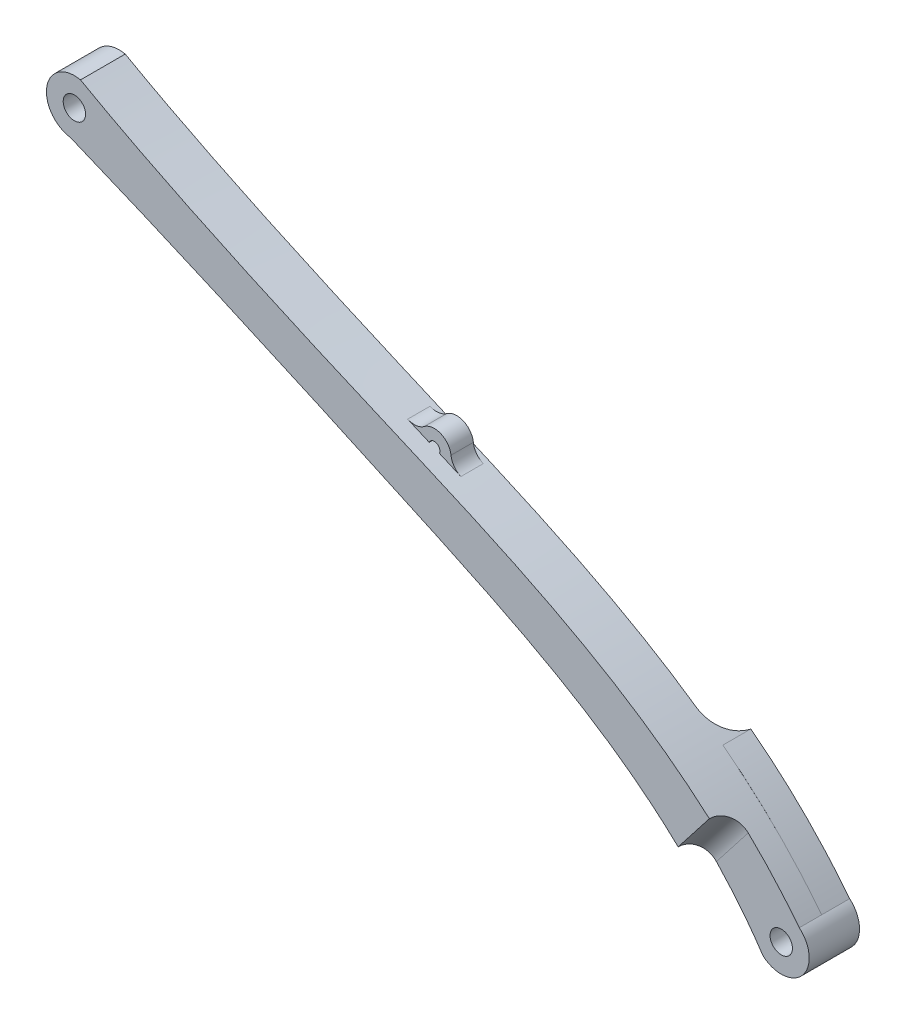
ISO-10303-21;
HEADER;
FILE_DESCRIPTION(('STEP AP214'),'2;1');
FILE_NAME('part.step','',(''),(''),'','','');
FILE_SCHEMA(('AUTOMOTIVE_DESIGN { 1 0 10303 214 1 1 1 1 }'));
ENDSEC;
DATA;
#1=APPLICATION_CONTEXT('core data for automotive mechanical design processes');
#2=APPLICATION_PROTOCOL_DEFINITION('international standard','automotive_design',2000,#1);
#3=PRODUCT_CONTEXT('',#1,'mechanical');
#4=PRODUCT('Part','Part','',(#3));
#5=PRODUCT_RELATED_PRODUCT_CATEGORY('part','',(#4));
#6=PRODUCT_DEFINITION_FORMATION('','',#4);
#7=PRODUCT_DEFINITION_CONTEXT('part definition',#1,'design');
#8=PRODUCT_DEFINITION('design','',#6,#7);
#9=PRODUCT_DEFINITION_SHAPE('','',#8);
#10=(LENGTH_UNIT() NAMED_UNIT(*) SI_UNIT(.MILLI.,.METRE.));
#11=(NAMED_UNIT(*) PLANE_ANGLE_UNIT() SI_UNIT($,.RADIAN.));
#12=(NAMED_UNIT(*) SI_UNIT($,.STERADIAN.) SOLID_ANGLE_UNIT());
#13=UNCERTAINTY_MEASURE_WITH_UNIT(LENGTH_MEASURE(1.E-05),#10,'distance_accuracy_value','');
#14=(GEOMETRIC_REPRESENTATION_CONTEXT(3) GLOBAL_UNCERTAINTY_ASSIGNED_CONTEXT((#13)) GLOBAL_UNIT_ASSIGNED_CONTEXT((#10,
#11,#12)) REPRESENTATION_CONTEXT('',''));
#15=CARTESIAN_POINT('',(0.,0.,0.));
#16=DIRECTION('',(0.,0.,1.));
#17=DIRECTION('',(1.,0.,0.));
#18=AXIS2_PLACEMENT_3D('',#15,#16,#17);
#19=CARTESIAN_POINT('',(-33.4795643294007,53.2943648182987,0.));
#20=DIRECTION('',(0.,0.,-1.));
#21=DIRECTION('',(-1.,0.,0.));
#22=AXIS2_PLACEMENT_3D('',#19,#20,#21);
#23=PLANE('',#22);
#24=CARTESIAN_POINT('',(-3.64828943786818,32.9515370917479,0.));
#25=CARTESIAN_POINT('',(-12.857763010959,44.7997287935044,0.));
#26=CARTESIAN_POINT('',(-35.6807009434984,53.9861716061866,0.));
#27=CARTESIAN_POINT('',(-58.2959280357336,64.1729227690394,0.));
#28=CARTESIAN_POINT('',(-65.9244972573378,68.4706995301469,0.));
#29=B_SPLINE_CURVE_WITH_KNOTS('',3,(#24,#25,#26,#27,#28),.UNSPECIFIED.,.F.,.F.,(4,1,4),(0.,
0.595320447466433,1.),.UNSPECIFIED.);
#30=CARTESIAN_POINT('',(-14.8682519255476,43.4286646731009,0.));
#31=VERTEX_POINT('',#30);
#32=CARTESIAN_POINT('',(-65.9244972573378,68.4706995301469,0.));
#33=VERTEX_POINT('',#32);
#34=EDGE_CURVE('E312',#31,#33,#29,.T.);
#35=ORIENTED_EDGE('',*,*,#34,.F.);
#36=DIRECTION('',(-0.608081317389844,-0.793874745436226,0.));
#37=VECTOR('',#36,1.);
#38=CARTESIAN_POINT('',(-17.5208638141146,39.9655726037439,0.));
#39=LINE('',#38,#37);
#40=CARTESIAN_POINT('',(-17.5217752728463,39.9643826575179,0.));
#41=VERTEX_POINT('',#40);
#42=EDGE_CURVE('E354',#31,#41,#39,.T.);
#43=ORIENTED_EDGE('',*,*,#42,.T.);
#44=CARTESIAN_POINT('',(-66.8315224674387,63.5573046162951,0.));
#45=CARTESIAN_POINT('',(-57.1578472891355,59.6165537703577,0.));
#46=CARTESIAN_POINT('',(-35.063902709753,49.6872164129519,0.));
#47=CARTESIAN_POINT('',(-13.8474255902419,39.616343892161,0.));
#48=CARTESIAN_POINT('',(-6.88167697666935,29.1377194474543,0.));
#49=B_SPLINE_CURVE_WITH_KNOTS('',3,(#44,#45,#46,#47,#48),.UNSPECIFIED.,.F.,.F.,(4,1,4),(0.,
0.486443492551131,1.),.UNSPECIFIED.);
#50=CARTESIAN_POINT('',(-66.8315224674387,63.5573046162951,0.));
#51=VERTEX_POINT('',#50);
#52=EDGE_CURVE('E322',#51,#41,#49,.T.);
#53=ORIENTED_EDGE('',*,*,#52,.F.);
#54=CARTESIAN_POINT('',(-66.471114726125,66.0311894681023,0.));
#55=DIRECTION('',(0.,0.,1.));
#56=DIRECTION('',(1.,0.,0.));
#57=AXIS2_PLACEMENT_3D('',#54,#55,#56);
#58=CIRCLE('',#57,2.5);
#59=EDGE_CURVE('E411',#33,#51,#58,.T.);
#60=ORIENTED_EDGE('',*,*,#59,.F.);
#61=EDGE_LOOP('',(#35,#43,#53,#60));
#62=FACE_BOUND('',#61,.T.);
#63=CARTESIAN_POINT('',(-66.471114726125,66.0311894681023,0.));
#64=DIRECTION('',(0.,0.,1.));
#65=DIRECTION('',(1.,0.,0.));
#66=AXIS2_PLACEMENT_3D('',#63,#64,#65);
#67=CIRCLE('',#66,0.999999999999998);
#68=CARTESIAN_POINT('',(-65.471114726125,66.0311894681023,0.));
#69=VERTEX_POINT('',#68);
#70=EDGE_CURVE('E313',#69,#69,#67,.T.);
#71=ORIENTED_EDGE('',*,*,#70,.T.);
#72=EDGE_LOOP('',(#71));
#73=FACE_BOUND('',#72,.T.);
#74=ADVANCED_FACE('F34',(#62,#73),#23,.T.);
#75=CARTESIAN_POINT('',(-33.4795643294007,53.2943648182987,4.));
#76=DIRECTION('',(0.,0.,-1.));
#77=DIRECTION('',(-1.,0.,0.));
#78=AXIS2_PLACEMENT_3D('',#75,#76,#77);
#79=PLANE('',#78);
#80=CARTESIAN_POINT('',(-66.8315224674387,63.5573046162951,4.));
#81=CARTESIAN_POINT('',(-57.1578472891355,59.6165537703577,4.));
#82=CARTESIAN_POINT('',(-35.063902709753,49.6872164129519,4.));
#83=CARTESIAN_POINT('',(-13.8474255902419,39.616343892161,4.));
#84=CARTESIAN_POINT('',(-6.88167697666935,29.1377194474543,4.));
#85=B_SPLINE_CURVE_WITH_KNOTS('',3,(#80,#81,#82,#83,#84),.UNSPECIFIED.,.F.,.F.,(4,1,4),(0.,
0.486443492551131,1.),.UNSPECIFIED.);
#86=CARTESIAN_POINT('',(-66.8315224674387,63.5573046162951,4.));
#87=VERTEX_POINT('',#86);
#88=CARTESIAN_POINT('',(-12.4832384817131,35.7983111891099,4.));
#89=VERTEX_POINT('',#88);
#90=EDGE_CURVE('E443',#87,#89,#85,.T.);
#91=ORIENTED_EDGE('',*,*,#90,.T.);
#92=DIRECTION('',(-0.615485826191315,-0.788147954230419,0.));
#93=VECTOR('',#92,1.);
#94=CARTESIAN_POINT('',(-13.337781874138,34.7040428926188,4.));
#95=LINE('',#94,#93);
#96=CARTESIAN_POINT('',(-9.69137665652255,39.3733735096092,4.));
#97=VERTEX_POINT('',#96);
#98=EDGE_CURVE('E193',#97,#89,#95,.T.);
#99=ORIENTED_EDGE('',*,*,#98,.F.);
#100=CARTESIAN_POINT('',(-3.64828943786818,32.9515370917479,4.));
#101=CARTESIAN_POINT('',(-12.857763010959,44.7997287935044,4.));
#102=CARTESIAN_POINT('',(-35.6807009434984,53.9861716061866,4.));
#103=CARTESIAN_POINT('',(-58.2959280357336,64.1729227690394,4.));
#104=CARTESIAN_POINT('',(-65.9244972573378,68.4706995301469,4.));
#105=B_SPLINE_CURVE_WITH_KNOTS('',3,(#100,#101,#102,#103,#104),.UNSPECIFIED.,.F.,.F.,(4,1,4),
(0.,0.595320447466433,1.),.UNSPECIFIED.);
#106=CARTESIAN_POINT('',(-65.9244972573378,68.4706995301469,4.));
#107=VERTEX_POINT('',#106);
#108=EDGE_CURVE('E316',#97,#107,#105,.T.);
#109=ORIENTED_EDGE('',*,*,#108,.T.);
#110=CARTESIAN_POINT('',(-66.471114726125,66.0311894681023,4.));
#111=DIRECTION('',(0.,0.,1.));
#112=DIRECTION('',(1.,0.,0.));
#113=AXIS2_PLACEMENT_3D('',#110,#111,#112);
#114=CIRCLE('',#113,2.5);
#115=EDGE_CURVE('E321',#107,#87,#114,.T.);
#116=ORIENTED_EDGE('',*,*,#115,.T.);
#117=EDGE_LOOP('',(#91,#99,#109,#116));
#118=FACE_BOUND('',#117,.T.);
#119=CARTESIAN_POINT('',(-66.471114726125,66.0311894681023,4.));
#120=DIRECTION('',(0.,0.,1.));
#121=DIRECTION('',(1.,0.,0.));
#122=AXIS2_PLACEMENT_3D('',#119,#120,#121);
#123=CIRCLE('',#122,0.999999999999998);
#124=CARTESIAN_POINT('',(-65.471114726125,66.0311894681023,4.));
#125=VERTEX_POINT('',#124);
#126=EDGE_CURVE('E304',#125,#125,#123,.T.);
#127=ORIENTED_EDGE('',*,*,#126,.F.);
#128=EDGE_LOOP('',(#127));
#129=FACE_BOUND('',#128,.T.);
#130=ADVANCED_FACE('F391',(#118,#129),#79,.F.);
#131=CARTESIAN_POINT('',(-6.88167697666923,29.1377194474544,0.));
#132=CARTESIAN_POINT('',(-10.3082664000285,34.2685087535792,0.));
#133=CARTESIAN_POINT('',(-15.1725506482203,38.1668438095986,0.));
#134=CARTESIAN_POINT('',(-34.6296876409876,53.7601840336764,0.));
#135=CARTESIAN_POINT('',(-54.0868246337549,69.3535242577542,0.));
#136=B_SPLINE_CURVE_WITH_KNOTS('',2,(#131,#132,#133,#134,#135),.UNSPECIFIED.,.F.,.F.,(3,2,3),
(0.,1.,5.),.UNSPECIFIED.);
#137=CARTESIAN_POINT('',(-8.90717026554215,31.9066961992547,0.));
#138=VERTEX_POINT('',#137);
#139=CARTESIAN_POINT('',(-15.1724433543358,38.1667578218353,0.));
#140=VERTEX_POINT('',#139);
#141=EDGE_CURVE('E225',#138,#140,#136,.T.);
#142=ORIENTED_EDGE('',*,*,#141,.F.);
#143=EDGE_CURVE('E408',#140,#138,#49,.T.);
#144=ORIENTED_EDGE('',*,*,#143,.F.);
#145=EDGE_LOOP('',(#142,#144));
#146=FACE_BOUND('',#145,.T.);
#147=ADVANCED_FACE('F333',(#146),#23,.T.);
#148=DIRECTION('',(0.,0.,-1.));
#149=VECTOR('',#148,1.);
#150=SURFACE_OF_LINEAR_EXTRUSION('',#105,#149);
#151=DIRECTION('',(0.,0.,-1.));
#152=VECTOR('',#151,1.);
#153=CARTESIAN_POINT('',(-33.4087643060272,53.2633275788224,0.5));
#154=LINE('',#153,#152);
#155=CARTESIAN_POINT('',(-33.4087643060273,53.2633275788224,0.5));
#156=VERTEX_POINT('',#155);
#157=CARTESIAN_POINT('',(-33.4087643060272,53.2633275788224,2.5));
#158=VERTEX_POINT('',#157);
#159=EDGE_CURVE('E165',#156,#158,#154,.F.);
#160=ORIENTED_EDGE('',*,*,#159,.T.);
#161=CARTESIAN_POINT('',(-3.64828943786818,32.9515370917479,2.5));
#162=CARTESIAN_POINT('',(-12.857763010959,44.7997287935044,2.5));
#163=CARTESIAN_POINT('',(-35.6807009434984,53.9861716061866,2.5));
#164=CARTESIAN_POINT('',(-58.2959280357336,64.1729227690394,2.5));
#165=CARTESIAN_POINT('',(-65.9244972573378,68.4706995301469,2.5));
#166=B_SPLINE_CURVE_WITH_KNOTS('',3,(#161,#162,#163,#164,#165),.UNSPECIFIED.,.F.,.F.,(4,1,4),
(0.,0.595320447466433,1.),.UNSPECIFIED.);
#167=CARTESIAN_POINT('',(-35.328129183,54.0990064950714,2.5));
#168=VERTEX_POINT('',#167);
#169=EDGE_CURVE('E158',#168,#158,#166,.F.);
#170=ORIENTED_EDGE('',*,*,#169,.F.);
#171=DIRECTION('',(0.,0.,-1.));
#172=VECTOR('',#171,1.);
#173=CARTESIAN_POINT('',(-35.3281291829999,54.0990064950714,4.));
#174=LINE('',#173,#172);
#175=CARTESIAN_POINT('',(-35.328129183,54.0990064950714,0.5));
#176=VERTEX_POINT('',#175);
#177=EDGE_CURVE('E162',#176,#168,#174,.F.);
#178=ORIENTED_EDGE('',*,*,#177,.F.);
#179=CARTESIAN_POINT('',(-3.64828943786818,32.9515370917479,0.5));
#180=CARTESIAN_POINT('',(-12.857763010959,44.7997287935044,0.5));
#181=CARTESIAN_POINT('',(-35.6807009434984,53.9861716061866,0.5));
#182=CARTESIAN_POINT('',(-58.2959280357336,64.1729227690394,0.5));
#183=CARTESIAN_POINT('',(-65.9244972573378,68.4706995301469,0.5));
#184=B_SPLINE_CURVE_WITH_KNOTS('',3,(#179,#180,#181,#182,#183),.UNSPECIFIED.,.F.,.F.,(4,1,4),
(0.,0.595320447466433,1.),.UNSPECIFIED.);
#185=EDGE_CURVE('E167',#176,#156,#184,.F.);
#186=ORIENTED_EDGE('',*,*,#185,.T.);
#187=EDGE_LOOP('',(#160,#170,#178,#186));
#188=FACE_BOUND('',#187,.T.);
#189=DIRECTION('',(0.,0.,-1.));
#190=VECTOR('',#189,1.);
#191=CARTESIAN_POINT('',(-38.172692184417,55.324122085199,2.5));
#192=LINE('',#191,#190);
#193=CARTESIAN_POINT('',(-38.172692184417,55.324122085199,2.5));
#194=VERTEX_POINT('',#193);
#195=CARTESIAN_POINT('',(-38.172692184417,55.324122085199,0.5));
#196=VERTEX_POINT('',#195);
#197=EDGE_CURVE('E657',#194,#196,#192,.T.);
#198=ORIENTED_EDGE('',*,*,#197,.T.);
#199=CARTESIAN_POINT('',(-36.246175205429,54.4954801668191,0.5));
#200=VERTEX_POINT('',#199);
#201=EDGE_CURVE('E643',#196,#200,#184,.F.);
#202=ORIENTED_EDGE('',*,*,#201,.T.);
#203=DIRECTION('',(0.,0.,-1.));
#204=VECTOR('',#203,1.);
#205=CARTESIAN_POINT('',(-36.246175205429,54.4954801668191,4.));
#206=LINE('',#205,#204);
#207=CARTESIAN_POINT('',(-36.246175205429,54.4954801668191,2.5));
#208=VERTEX_POINT('',#207);
#209=EDGE_CURVE('E642',#208,#200,#206,.T.);
#210=ORIENTED_EDGE('',*,*,#209,.F.);
#211=EDGE_CURVE('E169',#194,#208,#166,.F.);
#212=ORIENTED_EDGE('',*,*,#211,.F.);
#213=EDGE_LOOP('',(#198,#202,#210,#212));
#214=FACE_BOUND('',#213,.T.);
#215=ORIENTED_EDGE('',*,*,#108,.F.);
#216=CARTESIAN_POINT('',(-9.69137665652255,39.3733735096092,4.));
#217=CARTESIAN_POINT('',(-9.69137674410338,39.3733728772994,3.94382455504995));
#218=CARTESIAN_POINT('',(-9.68960051035681,39.3718001408176,3.8876760334606));
#219=CARTESIAN_POINT('',(-9.68251679948991,39.3655233614944,3.77578105651473));
#220=CARTESIAN_POINT('',(-9.67720949744156,39.3608194738968,3.72003458136308));
#221=CARTESIAN_POINT('',(-9.65604656025764,39.342051255568,3.55409828063488));
#222=CARTESIAN_POINT('',(-9.63494973127647,39.3233302633422,3.44502042351059));
#223=CARTESIAN_POINT('',(-9.57942690514854,39.2739252551691,3.23315206579693));
#224=CARTESIAN_POINT('',(-9.54499460699849,39.2432355839785,3.13036456402407));
#225=CARTESIAN_POINT('',(-9.46388082561542,39.1706670604513,2.93398971549011));
#226=CARTESIAN_POINT('',(-9.41720141222651,39.1287900988196,2.84040081777415));
#227=CARTESIAN_POINT('',(-9.31301776264208,39.0348899040119,2.66502708553264));
#228=CARTESIAN_POINT('',(-9.25550861438817,38.9828620663009,2.58324763729219));
#229=CARTESIAN_POINT('',(-9.13143485140982,38.8700031862913,2.43382328476245));
#230=CARTESIAN_POINT('',(-9.06486856318612,38.8091705169799,2.36618099848602));
#231=CARTESIAN_POINT('',(-8.92458361645207,38.6801896724735,2.24682196972485));
#232=CARTESIAN_POINT('',(-8.85085147555643,38.6120276806647,2.19513604243321));
#233=CARTESIAN_POINT('',(-8.69855419650848,38.4703104910771,2.10930317292974));
#234=CARTESIAN_POINT('',(-8.61999152979488,38.3967580475747,2.07514734405528));
#235=CARTESIAN_POINT('',(-8.48679724209731,38.2712038483056,2.03351454993829));
#236=CARTESIAN_POINT('',(-8.43283885232886,38.2201147301334,2.0209509203141));
#237=CARTESIAN_POINT('',(-8.32455524263464,38.117120724199,2.00419465120245));
#238=CARTESIAN_POINT('',(-8.27023067314975,38.0652171360881,1.99998981921596));
#239=CARTESIAN_POINT('',(-8.21600620994747,38.0131637937517,2.));
#240=B_SPLINE_CURVE_WITH_KNOTS('',3,(#216,#217,#218,#219,#220,#221,#222,#223,#224,#225,#226,
#227,#228,#229,#230,#231,#232,#233,#234,#235,#236,#237,#238,#239),.UNSPECIFIED.,.F.,.F.,(4,2,2,
2,2,2,2,2,2,2,2,4),(0.,0.168422779916882,0.336837209977326,0.673099903502397,1.00952167522201,
1.3458866260045,1.682404511402,2.01898466028972,2.35621080999779,2.69326583788177,
2.91891187606395,3.14422853508656),.UNSPECIFIED.);
#241=CARTESIAN_POINT('',(-8.21600620995042,38.0131637937546,2.));
#242=VERTEX_POINT('',#241);
#243=EDGE_CURVE('E347',#97,#242,#240,.T.);
#244=ORIENTED_EDGE('',*,*,#243,.T.);
#245=CARTESIAN_POINT('',(-3.64828943786818,32.9515370917479,2.));
#246=CARTESIAN_POINT('',(-12.857763010959,44.7997287935044,2.));
#247=CARTESIAN_POINT('',(-35.6807009434984,53.9861716061866,2.));
#248=CARTESIAN_POINT('',(-58.2959280357336,64.1729227690394,2.));
#249=CARTESIAN_POINT('',(-65.9244972573378,68.4706995301469,2.));
#250=B_SPLINE_CURVE_WITH_KNOTS('',3,(#245,#246,#247,#248,#249),.UNSPECIFIED.,.F.,.F.,(4,1,4),
(0.,0.595320447466433,1.),.UNSPECIFIED.);
#251=CARTESIAN_POINT('',(-3.64828943786817,32.9515370917479,2.));
#252=VERTEX_POINT('',#251);
#253=EDGE_CURVE('E204',#242,#252,#250,.F.);
#254=ORIENTED_EDGE('',*,*,#253,.T.);
#255=DIRECTION('',(0.,0.,-1.));
#256=VECTOR('',#255,1.);
#257=CARTESIAN_POINT('',(-3.64828943786815,32.9515370917479,4.));
#258=LINE('',#257,#256);
#259=CARTESIAN_POINT('',(-3.64828943786807,32.951537091748,0.));
#260=VERTEX_POINT('',#259);
#261=EDGE_CURVE('E442',#252,#260,#258,.T.);
#262=ORIENTED_EDGE('',*,*,#261,.T.);
#263=CARTESIAN_POINT('',(-7.19390268948244,37.002694043265,0.));
#264=CARTESIAN_POINT('',(-5.3157641881717,35.081896858445,0.));
#265=CARTESIAN_POINT('',(-3.64828943786808,32.951537091748,0.));
#266=B_SPLINE_CURVE_WITH_KNOTS('',2,(#263,#264,#265),.UNSPECIFIED.,.F.,.F.,(3,3),
(0.567342317631854,1.),.UNSPECIFIED.);
#267=CARTESIAN_POINT('',(-7.19390268948315,37.0026940432657,0.));
#268=VERTEX_POINT('',#267);
#269=EDGE_CURVE('E217',#268,#260,#266,.T.);
#270=ORIENTED_EDGE('',*,*,#269,.F.);
#271=CARTESIAN_POINT('',(-12.4815775275615,41.6797030452184,0.));
#272=VERTEX_POINT('',#271);
#273=EDGE_CURVE('E415',#268,#272,#29,.T.);
#274=ORIENTED_EDGE('',*,*,#273,.T.);
#275=CARTESIAN_POINT('',(-52.3170293107608,72.1149399718309,0.));
#276=CARTESIAN_POINT('',(-32.3993795155565,56.89737964822,0.));
#277=CARTESIAN_POINT('',(-12.4817297203522,41.679819324609,0.));
#278=CARTESIAN_POINT('',(-7.5023172715511,37.8754292437063,0.));
#279=CARTESIAN_POINT('',(-3.64828943786808,32.951537091748,0.));
#280=B_SPLINE_CURVE_WITH_KNOTS('',2,(#275,#276,#277,#278,#279),.UNSPECIFIED.,.F.,.F.,(3,2,3),
(-4.,0.,1.),.UNSPECIFIED.);
#281=CARTESIAN_POINT('',(-12.4817297203522,41.6798193246091,0.));
#282=VERTEX_POINT('',#281);
#283=EDGE_CURVE('E259',#282,#272,#280,.T.);
#284=ORIENTED_EDGE('',*,*,#283,.F.);
#285=DIRECTION('',(0.,0.,1.));
#286=VECTOR('',#285,1.);
#287=CARTESIAN_POINT('',(-12.4817297203522,41.679819324609,-2.5));
#288=LINE('',#287,#286);
#289=CARTESIAN_POINT('',(-12.4817297203522,41.679819324609,-2.5));
#290=VERTEX_POINT('',#289);
#291=EDGE_CURVE('E270',#290,#282,#288,.T.);
#292=ORIENTED_EDGE('',*,*,#291,.F.);
#293=CARTESIAN_POINT('',(-12.4817297203522,41.679819324609,-2.5));
#294=CARTESIAN_POINT('',(-12.4928531296063,41.6884087923681,-2.41680878124046));
#295=CARTESIAN_POINT('',(-12.5067677911344,41.6991504731235,-2.33421723213937));
#296=CARTESIAN_POINT('',(-12.5400672218254,41.7248203252763,-2.17081046004454));
#297=CARTESIAN_POINT('',(-12.5594517319828,41.7397482984463,-2.08999515313837));
#298=CARTESIAN_POINT('',(-12.6035654513832,41.7736628063177,-1.93076071198333));
#299=CARTESIAN_POINT('',(-12.6282912405653,41.7926467438698,-1.85234008090975));
#300=CARTESIAN_POINT('',(-12.6829216121479,41.834504570449,-1.69842086123617));
#301=CARTESIAN_POINT('',(-12.7128261309724,41.8573784117221,-1.6229222367785));
#302=CARTESIAN_POINT('',(-12.8100843338346,41.9315940529366,-1.40154147017032));
#303=CARTESIAN_POINT('',(-12.8849997816566,41.9885431987462,-1.26071270270367));
#304=CARTESIAN_POINT('',(-13.0529161186079,42.1153842659671,-0.996977558046802));
#305=CARTESIAN_POINT('',(-13.1459113159715,42.1852721137586,-0.874065561651677));
#306=CARTESIAN_POINT('',(-13.3475736257296,42.3357230350049,-0.649538412545029));
#307=CARTESIAN_POINT('',(-13.4562345892221,42.4162819190146,-0.54791494217845));
#308=CARTESIAN_POINT('',(-13.6864443625629,42.5855883451863,-0.368758099561227));
#309=CARTESIAN_POINT('',(-13.8080012652104,42.6743410247471,-0.291239975904765));
#310=CARTESIAN_POINT('',(-14.060644972737,42.8572402420987,-0.162550137641213));
#311=CARTESIAN_POINT('',(-14.1917344723962,42.9513883035092,-0.11138590634458));
#312=CARTESIAN_POINT('',(-14.459649060328,43.1421256258332,-0.0369511635634263));
#313=CARTESIAN_POINT('',(-14.5964611026547,43.2387091539512,-0.0136204407515353));
#314=CARTESIAN_POINT('',(-14.7564042988229,43.3506478558268,-0.00296975266422943));
#315=CARTESIAN_POINT('',(-14.7787627202734,43.3662737763583,-0.00185561553738341));
#316=CARTESIAN_POINT('',(-14.8234927539268,43.3974914249381,-0.000371694694946978));
#317=CARTESIAN_POINT('',(-14.845864326862,43.4130831716759,-1.12121545885719E-06));
#318=CARTESIAN_POINT('',(-14.8682519255477,43.4286646731009,0.));
#319=B_SPLINE_CURVE_WITH_KNOTS('',3,(#293,#294,#295,#296,#297,#298,#299,#300,#301,#302,#303,
#304,#305,#306,#307,#308,#309,#310,#311,#312,#313,#314,#315,#316,#317,#318),.UNSPECIFIED.,.F.,
.F.,(4,2,2,2,2,2,2,2,2,2,2,2,4),(0.,0.253027536021507,0.506043092826113,0.758897119562155,
1.01174804239141,1.51725612175161,2.02260531682331,2.52775669677163,3.03322697908347,
3.53884071302003,4.04335867422708,4.12525698970064,4.20706827208186),.UNSPECIFIED.);
#320=EDGE_CURVE('E361',#290,#31,#319,.T.);
#321=ORIENTED_EDGE('',*,*,#320,.T.);
#322=ORIENTED_EDGE('',*,*,#34,.T.);
#323=DIRECTION('',(0.,0.,-1.));
#324=VECTOR('',#323,1.);
#325=CARTESIAN_POINT('',(-65.9244972573378,68.4706995301469,4.));
#326=LINE('',#325,#324);
#327=EDGE_CURVE('E434',#107,#33,#326,.T.);
#328=ORIENTED_EDGE('',*,*,#327,.F.);
#329=EDGE_LOOP('',(#215,#244,#254,#262,#270,#274,#284,#292,#321,#322,#328));
#330=FACE_BOUND('',#329,.T.);
#331=ADVANCED_FACE('F160',(#188,#214,#330),#150,.F.);
#332=CARTESIAN_POINT('',(-66.471114726125,66.0311894681023,4.));
#333=DIRECTION('',(0.,0.,-1.));
#334=DIRECTION('',(-1.,0.,0.));
#335=AXIS2_PLACEMENT_3D('',#332,#333,#334);
#336=CYLINDRICAL_SURFACE('',#335,2.5);
#337=ORIENTED_EDGE('',*,*,#59,.T.);
#338=DIRECTION('',(0.,0.,-1.));
#339=VECTOR('',#338,1.);
#340=CARTESIAN_POINT('',(-66.8315224674387,63.5573046162951,4.));
#341=LINE('',#340,#339);
#342=EDGE_CURVE('E428',#87,#51,#341,.T.);
#343=ORIENTED_EDGE('',*,*,#342,.F.);
#344=ORIENTED_EDGE('',*,*,#115,.F.);
#345=ORIENTED_EDGE('',*,*,#327,.T.);
#346=EDGE_LOOP('',(#337,#343,#344,#345));
#347=FACE_BOUND('',#346,.T.);
#348=ADVANCED_FACE('F332',(#347),#336,.T.);
#349=DIRECTION('',(0.,0.,-1.));
#350=VECTOR('',#349,1.);
#351=SURFACE_OF_LINEAR_EXTRUSION('',#85,#350);
#352=CARTESIAN_POINT('',(-66.8315224674387,63.5573046162951,2.));
#353=CARTESIAN_POINT('',(-57.1578472891355,59.6165537703577,2.));
#354=CARTESIAN_POINT('',(-35.063902709753,49.6872164129519,2.));
#355=CARTESIAN_POINT('',(-13.8474255902419,39.616343892161,2.));
#356=CARTESIAN_POINT('',(-6.88167697666935,29.1377194474543,2.));
#357=B_SPLINE_CURVE_WITH_KNOTS('',3,(#352,#353,#354,#355,#356),.UNSPECIFIED.,.F.,.F.,(4,1,4),
(0.,0.486443492551131,1.),.UNSPECIFIED.);
#358=CARTESIAN_POINT('',(-6.88167697666935,29.1377194474543,2.));
#359=VERTEX_POINT('',#358);
#360=CARTESIAN_POINT('',(-11.0603082466781,34.370950218552,2.));
#361=VERTEX_POINT('',#360);
#362=EDGE_CURVE('E197',#359,#361,#357,.F.);
#363=ORIENTED_EDGE('',*,*,#362,.T.);
#364=CARTESIAN_POINT('',(-11.0603082466413,34.370950218587,2.));
#365=CARTESIAN_POINT('',(-11.0995818285701,34.4123290248527,2.00000066598047));
#366=CARTESIAN_POINT('',(-11.1389256805472,34.4536045715666,2.00238906501043));
#367=CARTESIAN_POINT('',(-11.2175086568815,34.5357021762662,2.0119284202931));
#368=CARTESIAN_POINT('',(-11.2567477812873,34.5765242344626,2.01907937433292));
#369=CARTESIAN_POINT('',(-11.3738393128452,34.6978352396595,2.0476321035835));
#370=CARTESIAN_POINT('',(-11.4511685891632,34.7772771735787,2.07613383017299));
#371=CARTESIAN_POINT('',(-11.6019950838041,34.9310341563288,2.15138170790056));
#372=CARTESIAN_POINT('',(-11.675489535427,35.0053455157771,2.19814083033976));
#373=CARTESIAN_POINT('',(-11.8163478454386,35.1467814407814,2.30864134573451));
#374=CARTESIAN_POINT('',(-11.8837136095477,35.2139082415353,2.37237743530806));
#375=CARTESIAN_POINT('',(-12.009753268898,35.3387458131054,2.51457674848013));
#376=CARTESIAN_POINT('',(-12.0684830369909,35.3965173811872,2.59293711473263));
#377=CARTESIAN_POINT('',(-12.1759220287069,35.5016858008087,2.76248379566405));
#378=CARTESIAN_POINT('',(-12.224629274231,35.5490806044523,2.85367263627167));
#379=CARTESIAN_POINT('',(-12.3101152658103,35.6319554502714,3.04557290601601));
#380=CARTESIAN_POINT('',(-12.3469741805755,35.6675156289209,3.14621411438399));
#381=CARTESIAN_POINT('',(-12.4080045595988,35.7262545479849,3.35466675290892));
#382=CARTESIAN_POINT('',(-12.432184403287,35.7494414659033,3.46247339430126));
#383=CARTESIAN_POINT('',(-12.4607980267421,35.7768505518874,3.64249761596755));
#384=CARTESIAN_POINT('',(-12.4692070231156,35.7848953369803,3.71354936573017));
#385=CARTESIAN_POINT('',(-12.4804268233911,35.7956238296993,3.8563904878811));
#386=CARTESIAN_POINT('',(-12.4832457007404,35.7983152688334,3.92817864577326));
#387=CARTESIAN_POINT('',(-12.4832384820942,35.7983111886219,4.));
#388=B_SPLINE_CURVE_WITH_KNOTS('',3,(#364,#365,#366,#367,#368,#369,#370,#371,#372,#373,#374,
#375,#376,#377,#378,#379,#380,#381,#382,#383,#384,#385,#386,#387),.UNSPECIFIED.,.F.,.F.,(4,2,2,
2,2,2,2,2,2,2,2,4),(0.,0.171044545856044,0.342089012237697,0.683736131032737,1.02562642224271,
1.36741003640879,1.70687465811933,2.0464062142659,2.38358954221403,2.72054974840984,
2.93615498116393,3.15144860179543),.UNSPECIFIED.);
#389=EDGE_CURVE('E355',#361,#89,#388,.T.);
#390=ORIENTED_EDGE('',*,*,#389,.T.);
#391=ORIENTED_EDGE('',*,*,#90,.F.);
#392=ORIENTED_EDGE('',*,*,#342,.T.);
#393=ORIENTED_EDGE('',*,*,#52,.T.);
#394=CARTESIAN_POINT('',(-17.5217752728414,39.9643826575245,0.));
#395=CARTESIAN_POINT('',(-17.4534134312998,39.9151011417556,8.1449735932445E-06));
#396=CARTESIAN_POINT('',(-17.3851714658434,39.8656595466742,-0.00354798642111512));
#397=CARTESIAN_POINT('',(-17.2494044619625,39.7668119915,-0.0177288059821834));
#398=CARTESIAN_POINT('',(-17.1818793912185,39.7174060298952,-0.0283531741081506));
#399=CARTESIAN_POINT('',(-17.0480626960335,39.61901455218,-0.0566008511107388));
#400=CARTESIAN_POINT('',(-16.9817702622422,39.5700287724458,-0.0742193845488539));
#401=CARTESIAN_POINT('',(-16.8508533071348,39.4728218254593,-0.116313996336045));
#402=CARTESIAN_POINT('',(-16.7862287635052,39.4246006479812,-0.14078998289218));
#403=CARTESIAN_POINT('',(-16.595458359313,39.28157335196,-0.22430951104233));
#404=CARTESIAN_POINT('',(-16.4723648977847,39.1883660537004,-0.293455410129299));
#405=CARTESIAN_POINT('',(-16.2380230953825,39.0093687033563,-0.456604713215503));
#406=CARTESIAN_POINT('',(-16.1267711712078,38.9235764089452,-0.550600567343669));
#407=CARTESIAN_POINT('',(-15.9189017598912,38.7620384767787,-0.760819209189489));
#408=CARTESIAN_POINT('',(-15.8222844911461,38.6862929889565,-0.877042328551863));
#409=CARTESIAN_POINT('',(-15.6461292750721,38.5472985413853,-1.12850967941653));
#410=CARTESIAN_POINT('',(-15.5666023462599,38.4840576457074,-1.26376608967536));
#411=CARTESIAN_POINT('',(-15.4265831072309,38.3721582857224,-1.54961402767601));
#412=CARTESIAN_POINT('',(-15.3661240115903,38.3235252740684,-1.70023171629334));
#413=CARTESIAN_POINT('',(-15.2660103182158,38.2427284404521,-2.01217253018304));
#414=CARTESIAN_POINT('',(-15.2263107668657,38.2105290361059,-2.17347166423242));
#415=CARTESIAN_POINT('',(-15.1927158725558,38.1832383376186,-2.36456297511481));
#416=CARTESIAN_POINT('',(-15.1882738633415,38.1796285309969,-2.39156503009088));
#417=CARTESIAN_POINT('',(-15.1799755057866,38.1728826880973,-2.44568800719441));
#418=CARTESIAN_POINT('',(-15.1761185380237,38.1697461507564,-2.47280877187788));
#419=CARTESIAN_POINT('',(-15.1725506482203,38.1668438095986,-2.5));
#420=B_SPLINE_CURVE_WITH_KNOTS('',3,(#394,#395,#396,#397,#398,#399,#400,#401,#402,#403,#404,
#405,#406,#407,#408,#409,#410,#411,#412,#413,#414,#415,#416,#417,#418,#419),.UNSPECIFIED.,.F.,
.F.,(4,2,2,2,2,2,2,2,2,2,2,2,4),(0.,0.252738400281106,0.505465357681142,0.758020055499241,
1.01057137281579,1.51548433933747,2.0202440799997,2.52501135258107,3.0301030897819,
3.53606985643081,4.04093639555194,4.12373955540899,4.20645442473894),.UNSPECIFIED.);
#421=CARTESIAN_POINT('',(-15.1725506482203,38.1668438095986,-2.5));
#422=VERTEX_POINT('',#421);
#423=EDGE_CURVE('E367',#41,#422,#420,.T.);
#424=ORIENTED_EDGE('',*,*,#423,.T.);
#425=DIRECTION('',(0.,0.,1.));
#426=VECTOR('',#425,1.);
#427=CARTESIAN_POINT('',(-15.1725506482203,38.1668438095986,-2.5));
#428=LINE('',#427,#426);
#429=CARTESIAN_POINT('',(-15.1725506482203,38.1668438095986,0.));
#430=VERTEX_POINT('',#429);
#431=EDGE_CURVE('E274',#422,#430,#428,.T.);
#432=ORIENTED_EDGE('',*,*,#431,.T.);
#433=EDGE_CURVE('E268',#140,#430,#136,.T.);
#434=ORIENTED_EDGE('',*,*,#433,.F.);
#435=ORIENTED_EDGE('',*,*,#143,.T.);
#436=CARTESIAN_POINT('',(-6.88167697666923,29.1377194474544,0.));
#437=CARTESIAN_POINT('',(-7.8383868519949,30.5702449679974,0.));
#438=CARTESIAN_POINT('',(-8.90717026554215,31.9066961992547,0.));
#439=B_SPLINE_CURVE_WITH_KNOTS('',2,(#436,#437,#438),.UNSPECIFIED.,.F.,.F.,(3,3),(0.,
0.279201782624938),.UNSPECIFIED.);
#440=CARTESIAN_POINT('',(-6.88167697666924,29.1377194474544,0.));
#441=VERTEX_POINT('',#440);
#442=EDGE_CURVE('E287',#441,#138,#439,.T.);
#443=ORIENTED_EDGE('',*,*,#442,.F.);
#444=DIRECTION('',(0.,0.,-1.));
#445=VECTOR('',#444,1.);
#446=CARTESIAN_POINT('',(-6.88167697666935,29.1377194474543,4.));
#447=LINE('',#446,#445);
#448=EDGE_CURVE('E435',#359,#441,#447,.T.);
#449=ORIENTED_EDGE('',*,*,#448,.F.);
#450=EDGE_LOOP('',(#363,#390,#391,#392,#393,#424,#432,#434,#435,#443,#449));
#451=FACE_BOUND('',#450,.T.);
#452=ADVANCED_FACE('F409',(#451),#351,.F.);
#453=CARTESIAN_POINT('',(-5.26498320726877,31.0446282696011,4.));
#454=DIRECTION('',(0.,0.,-1.));
#455=DIRECTION('',(-1.,0.,0.));
#456=AXIS2_PLACEMENT_3D('',#453,#454,#455);
#457=CYLINDRICAL_SURFACE('',#456,2.50000000000006);
#458=ORIENTED_EDGE('',*,*,#261,.F.);
#459=CARTESIAN_POINT('',(-5.26498320726877,31.0446282696011,2.));
#460=DIRECTION('',(0.,0.,1.));
#461=DIRECTION('',(1.,0.,0.));
#462=AXIS2_PLACEMENT_3D('',#459,#460,#461);
#463=CIRCLE('',#462,2.50000000000003);
#464=EDGE_CURVE('E194',#359,#252,#463,.T.);
#465=ORIENTED_EDGE('',*,*,#464,.F.);
#466=ORIENTED_EDGE('',*,*,#448,.T.);
#467=DIRECTION('',(0.,0.,1.));
#468=VECTOR('',#467,1.);
#469=CARTESIAN_POINT('',(-6.88167697666924,29.1377194474544,-2.5));
#470=LINE('',#469,#468);
#471=CARTESIAN_POINT('',(-6.88167697666924,29.1377194474544,-2.5));
#472=VERTEX_POINT('',#471);
#473=EDGE_CURVE('E275',#472,#441,#470,.T.);
#474=ORIENTED_EDGE('',*,*,#473,.F.);
#475=CARTESIAN_POINT('',(-5.26498320726793,31.0446282696006,-2.5));
#476=DIRECTION('',(0.,0.,-1.));
#477=DIRECTION('',(-1.,0.,0.));
#478=AXIS2_PLACEMENT_3D('',#475,#476,#477);
#479=CIRCLE('',#478,2.5);
#480=CARTESIAN_POINT('',(-3.64828943786807,32.951537091748,-2.5));
#481=VERTEX_POINT('',#480);
#482=EDGE_CURVE('E224',#481,#472,#479,.T.);
#483=ORIENTED_EDGE('',*,*,#482,.F.);
#484=DIRECTION('',(0.,0.,1.));
#485=VECTOR('',#484,1.);
#486=CARTESIAN_POINT('',(-3.64828943786807,32.951537091748,-2.5));
#487=LINE('',#486,#485);
#488=EDGE_CURVE('E260',#481,#260,#487,.T.);
#489=ORIENTED_EDGE('',*,*,#488,.T.);
#490=EDGE_LOOP('',(#458,#465,#466,#474,#483,#489));
#491=FACE_BOUND('',#490,.T.);
#492=ADVANCED_FACE('F462',(#491),#457,.T.);
#493=CARTESIAN_POINT('',(-66.471114726125,66.0311894681023,4.));
#494=DIRECTION('',(0.,0.,-1.));
#495=DIRECTION('',(-1.,0.,0.));
#496=AXIS2_PLACEMENT_3D('',#493,#494,#495);
#497=CYLINDRICAL_SURFACE('',#496,0.999999999999998);
#498=ORIENTED_EDGE('',*,*,#126,.T.);
#499=EDGE_LOOP('',(#498));
#500=FACE_BOUND('',#499,.T.);
#501=ORIENTED_EDGE('',*,*,#70,.F.);
#502=EDGE_LOOP('',(#501));
#503=FACE_BOUND('',#502,.T.);
#504=ADVANCED_FACE('F488',(#500,#503),#497,.F.);
#505=CARTESIAN_POINT('',(-5.26498320726877,31.0446282696011,4.));
#506=DIRECTION('',(0.,0.,-1.));
#507=DIRECTION('',(-1.,0.,0.));
#508=AXIS2_PLACEMENT_3D('',#505,#506,#507);
#509=CYLINDRICAL_SURFACE('',#508,1.);
#510=CARTESIAN_POINT('',(-5.26498320726877,31.0446282696011,2.));
#511=DIRECTION('',(0.,0.,1.));
#512=DIRECTION('',(1.,0.,0.));
#513=AXIS2_PLACEMENT_3D('',#510,#511,#512);
#514=CIRCLE('',#513,1.00000000000001);
#515=CARTESIAN_POINT('',(-4.26498320726876,31.0446282696011,2.));
#516=VERTEX_POINT('',#515);
#517=EDGE_CURVE('E189',#516,#516,#514,.T.);
#518=ORIENTED_EDGE('',*,*,#517,.T.);
#519=EDGE_LOOP('',(#518));
#520=FACE_BOUND('',#519,.T.);
#521=CARTESIAN_POINT('',(-5.26498320726793,31.0446282696006,-2.5));
#522=DIRECTION('',(0.,0.,-1.));
#523=DIRECTION('',(-1.,0.,0.));
#524=AXIS2_PLACEMENT_3D('',#521,#522,#523);
#525=CIRCLE('',#524,1.);
#526=CARTESIAN_POINT('',(-6.26498320726793,31.0446282696006,-2.5));
#527=VERTEX_POINT('',#526);
#528=EDGE_CURVE('E211',#527,#527,#525,.T.);
#529=ORIENTED_EDGE('',*,*,#528,.T.);
#530=EDGE_LOOP('',(#529));
#531=FACE_BOUND('',#530,.T.);
#532=ADVANCED_FACE('F241',(#520,#531),#509,.F.);
#533=CARTESIAN_POINT('',(-7.78366342533061,37.5955537259424,0.));
#534=DIRECTION('',(0.,0.,-1.));
#535=DIRECTION('',(-1.,0.,0.));
#536=AXIS2_PLACEMENT_3D('',#533,#534,#535);
#537=PLANE('',#536);
#538=EDGE_CURVE('E250',#272,#268,#280,.T.);
#539=ORIENTED_EDGE('',*,*,#538,.F.);
#540=ORIENTED_EDGE('',*,*,#273,.F.);
#541=EDGE_LOOP('',(#539,#540));
#542=FACE_BOUND('',#541,.T.);
#543=ADVANCED_FACE('F469',(#542),#537,.F.);
#544=CARTESIAN_POINT('',(-7.78366342533061,37.5955537259424,-2.5));
#545=DIRECTION('',(0.,0.,-1.));
#546=DIRECTION('',(-1.,0.,0.));
#547=AXIS2_PLACEMENT_3D('',#544,#545,#546);
#548=PLANE('',#547);
#549=CARTESIAN_POINT('',(-12.4817297203522,41.679819324609,-2.5));
#550=CARTESIAN_POINT('',(-7.5023172715511,37.8754292437063,-2.5));
#551=CARTESIAN_POINT('',(-3.64828943786808,32.951537091748,-2.5));
#552=B_SPLINE_CURVE_WITH_KNOTS('',2,(#549,#550,#551),.UNSPECIFIED.,.F.,.F.,(3,3),(0.,1.),.UNSPECIFIED.);
#553=EDGE_CURVE('E218',#290,#481,#552,.T.);
#554=ORIENTED_EDGE('',*,*,#553,.T.);
#555=ORIENTED_EDGE('',*,*,#482,.T.);
#556=CARTESIAN_POINT('',(-6.88167697666923,29.1377194474544,-2.5));
#557=CARTESIAN_POINT('',(-10.3082664000285,34.2685087535792,-2.5));
#558=CARTESIAN_POINT('',(-15.1725506482203,38.1668438095986,-2.5));
#559=B_SPLINE_CURVE_WITH_KNOTS('',2,(#556,#557,#558),.UNSPECIFIED.,.F.,.F.,(3,3),(0.,1.),.UNSPECIFIED.);
#560=EDGE_CURVE('E670',#472,#422,#559,.T.);
#561=ORIENTED_EDGE('',*,*,#560,.T.);
#562=DIRECTION('',(0.608081317389844,0.793874745436226,0.));
#563=VECTOR('',#562,1.);
#564=CARTESIAN_POINT('',(-12.4817297203522,41.679819324609,-2.5));
#565=LINE('',#564,#563);
#566=EDGE_CURVE('E269',#422,#290,#565,.T.);
#567=ORIENTED_EDGE('',*,*,#566,.T.);
#568=EDGE_LOOP('',(#554,#555,#561,#567));
#569=FACE_BOUND('',#568,.T.);
#570=ORIENTED_EDGE('',*,*,#528,.F.);
#571=EDGE_LOOP('',(#570));
#572=FACE_BOUND('',#571,.T.);
#573=ADVANCED_FACE('F237',(#569,#572),#548,.T.);
#574=DIRECTION('',(0.,0.,1.));
#575=VECTOR('',#574,1.);
#576=SURFACE_OF_LINEAR_EXTRUSION('',#552,#575);
#577=ORIENTED_EDGE('',*,*,#283,.T.);
#578=ORIENTED_EDGE('',*,*,#538,.T.);
#579=ORIENTED_EDGE('',*,*,#269,.T.);
#580=ORIENTED_EDGE('',*,*,#488,.F.);
#581=ORIENTED_EDGE('',*,*,#553,.F.);
#582=ORIENTED_EDGE('',*,*,#291,.T.);
#583=EDGE_LOOP('',(#577,#578,#579,#580,#581,#582));
#584=FACE_BOUND('',#583,.T.);
#585=ADVANCED_FACE('F231',(#584),#576,.F.);
#586=DIRECTION('',(0.,0.,1.));
#587=VECTOR('',#586,1.);
#588=SURFACE_OF_LINEAR_EXTRUSION('',#559,#587);
#589=ORIENTED_EDGE('',*,*,#442,.T.);
#590=ORIENTED_EDGE('',*,*,#141,.T.);
#591=ORIENTED_EDGE('',*,*,#433,.T.);
#592=ORIENTED_EDGE('',*,*,#431,.F.);
#593=ORIENTED_EDGE('',*,*,#560,.F.);
#594=ORIENTED_EDGE('',*,*,#473,.T.);
#595=EDGE_LOOP('',(#589,#590,#591,#592,#593,#594));
#596=FACE_BOUND('',#595,.T.);
#597=ADVANCED_FACE('F236',(#596),#588,.F.);
#598=CARTESIAN_POINT('',(-5.30231153717872,37.6138552426891,2.));
#599=DIRECTION('',(0.,0.,-1.));
#600=DIRECTION('',(-1.,0.,0.));
#601=AXIS2_PLACEMENT_3D('',#598,#599,#600);
#602=PLANE('',#601);
#603=ORIENTED_EDGE('',*,*,#517,.F.);
#604=EDGE_LOOP('',(#603));
#605=FACE_BOUND('',#604,.T.);
#606=ORIENTED_EDGE('',*,*,#253,.F.);
#607=DIRECTION('',(-0.615485826191315,-0.788147954230419,0.));
#608=VECTOR('',#607,1.);
#609=CARTESIAN_POINT('',(-10.9069425732523,34.5673395367273,2.));
#610=LINE('',#609,#608);
#611=EDGE_CURVE('E438',#242,#361,#610,.T.);
#612=ORIENTED_EDGE('',*,*,#611,.T.);
#613=ORIENTED_EDGE('',*,*,#362,.F.);
#614=ORIENTED_EDGE('',*,*,#464,.T.);
#615=EDGE_LOOP('',(#606,#612,#613,#614));
#616=FACE_BOUND('',#615,.T.);
#617=ADVANCED_FACE('F458',(#605,#616),#602,.F.);
#618=CARTESIAN_POINT('',(-7.30593436934758,39.1785379239217,4.));
#619=DIRECTION('',(0.615485826191315,0.788147954230419,0.));
#620=DIRECTION('',(-0.788147954230419,0.615485826191315,0.));
#621=AXIS2_PLACEMENT_3D('',#618,#619,#620);
#622=CYLINDRICAL_SURFACE('',#621,2.);
#623=ORIENTED_EDGE('',*,*,#243,.F.);
#624=ORIENTED_EDGE('',*,*,#98,.T.);
#625=ORIENTED_EDGE('',*,*,#389,.F.);
#626=ORIENTED_EDGE('',*,*,#611,.F.);
#627=EDGE_LOOP('',(#623,#624,#625,#626));
#628=FACE_BOUND('',#627,.T.);
#629=ADVANCED_FACE('F335',(#628),#622,.F.);
#630=CARTESIAN_POINT('',(-14.8300428862465,43.4785481187543,-3.));
#631=DIRECTION('',(0.608081317389844,0.793874745436226,0.));
#632=DIRECTION('',(-0.793874745436226,0.608081317389844,0.));
#633=AXIS2_PLACEMENT_3D('',#630,#631,#632);
#634=CYLINDRICAL_SURFACE('',#633,3.);
#635=ORIENTED_EDGE('',*,*,#423,.F.);
#636=ORIENTED_EDGE('',*,*,#42,.F.);
#637=ORIENTED_EDGE('',*,*,#320,.F.);
#638=ORIENTED_EDGE('',*,*,#566,.F.);
#639=EDGE_LOOP('',(#635,#636,#637,#638));
#640=FACE_BOUND('',#639,.T.);
#641=ADVANCED_FACE('F373',(#640),#634,.F.);
#642=CARTESIAN_POINT('',(-35.7870811841619,54.2974077567345,2.5));
#643=DIRECTION('',(0.,0.,-1.));
#644=DIRECTION('',(-1.,0.,0.));
#645=AXIS2_PLACEMENT_3D('',#642,#643,#644);
#646=CYLINDRICAL_SURFACE('',#645,1.5);
#647=CARTESIAN_POINT('',(-35.7870811841619,54.2974077567345,0.5));
#648=DIRECTION('',(0.,0.,-1.));
#649=DIRECTION('',(-1.,0.,0.));
#650=AXIS2_PLACEMENT_3D('',#647,#648,#649);
#651=CIRCLE('',#650,1.5);
#652=CARTESIAN_POINT('',(-36.6838133502002,55.4998516940522,0.5));
#653=VERTEX_POINT('',#652);
#654=CARTESIAN_POINT('',(-34.2967254108934,54.4672302201644,0.5));
#655=VERTEX_POINT('',#654);
#656=EDGE_CURVE('E182',#653,#655,#651,.T.);
#657=ORIENTED_EDGE('',*,*,#656,.F.);
#658=DIRECTION('',(0.,0.,-1.));
#659=VECTOR('',#658,1.);
#660=CARTESIAN_POINT('',(-36.6838133502002,55.4998516940522,2.5));
#661=LINE('',#660,#659);
#662=CARTESIAN_POINT('',(-36.6838133502002,55.4998516940522,2.5));
#663=VERTEX_POINT('',#662);
#664=EDGE_CURVE('E55',#653,#663,#661,.F.);
#665=ORIENTED_EDGE('',*,*,#664,.T.);
#666=CARTESIAN_POINT('',(-35.7870811841619,54.2974077567345,2.5));
#667=DIRECTION('',(0.,0.,-1.));
#668=DIRECTION('',(-1.,0.,0.));
#669=AXIS2_PLACEMENT_3D('',#666,#667,#668);
#670=CIRCLE('',#669,1.5);
#671=CARTESIAN_POINT('',(-34.2967254108934,54.4672302201644,2.5));
#672=VERTEX_POINT('',#671);
#673=EDGE_CURVE('E185',#663,#672,#670,.T.);
#674=ORIENTED_EDGE('',*,*,#673,.T.);
#675=DIRECTION('',(0.,0.,-1.));
#676=VECTOR('',#675,1.);
#677=CARTESIAN_POINT('',(-34.2967254108934,54.4672302201644,2.5));
#678=LINE('',#677,#676);
#679=EDGE_CURVE('E660',#672,#655,#678,.T.);
#680=ORIENTED_EDGE('',*,*,#679,.T.);
#681=EDGE_LOOP('',(#657,#665,#674,#680));
#682=FACE_BOUND('',#681,.T.);
#683=ADVANCED_FACE('F376',(#682),#646,.T.);
#684=CARTESIAN_POINT('',(-35.7870811841619,54.2974077567345,2.5));
#685=DIRECTION('',(0.,0.,-1.));
#686=DIRECTION('',(-1.,0.,0.));
#687=AXIS2_PLACEMENT_3D('',#684,#685,#686);
#688=PLANE('',#687);
#689=ORIENTED_EDGE('',*,*,#673,.F.);
#690=CARTESIAN_POINT('',(-37.5805455162386,56.7022956313699,2.5));
#691=DIRECTION('',(0.,0.,-1.));
#692=DIRECTION('',(-1.,0.,0.));
#693=AXIS2_PLACEMENT_3D('',#690,#691,#692);
#694=CIRCLE('',#693,1.5);
#695=EDGE_CURVE('E665',#663,#194,#694,.T.);
#696=ORIENTED_EDGE('',*,*,#695,.T.);
#697=ORIENTED_EDGE('',*,*,#211,.T.);
#698=CARTESIAN_POINT('',(-35.7870811841619,54.2974077567345,2.5));
#699=DIRECTION('',(0.,0.,-1.));
#700=DIRECTION('',(-1.,0.,0.));
#701=AXIS2_PLACEMENT_3D('',#698,#699,#700);
#702=CIRCLE('',#701,0.499999999999999);
#703=EDGE_CURVE('E175',#208,#168,#702,.T.);
#704=ORIENTED_EDGE('',*,*,#703,.T.);
#705=ORIENTED_EDGE('',*,*,#169,.T.);
#706=CARTESIAN_POINT('',(-32.8063696376249,54.6370526835942,2.5));
#707=DIRECTION('',(0.,0.,-1.));
#708=DIRECTION('',(-1.,0.,0.));
#709=AXIS2_PLACEMENT_3D('',#706,#707,#708);
#710=CIRCLE('',#709,1.5);
#711=EDGE_CURVE('E42',#158,#672,#710,.T.);
#712=ORIENTED_EDGE('',*,*,#711,.T.);
#713=EDGE_LOOP('',(#689,#696,#697,#704,#705,#712));
#714=FACE_BOUND('',#713,.T.);
#715=ADVANCED_FACE('F180',(#714),#688,.F.);
#716=CARTESIAN_POINT('',(-35.7870811841619,54.2974077567345,0.5));
#717=DIRECTION('',(0.,0.,-1.));
#718=DIRECTION('',(-1.,0.,0.));
#719=AXIS2_PLACEMENT_3D('',#716,#717,#718);
#720=PLANE('',#719);
#721=ORIENTED_EDGE('',*,*,#201,.F.);
#722=CARTESIAN_POINT('',(-37.5805455162386,56.7022956313699,0.5));
#723=DIRECTION('',(0.,0.,-1.));
#724=DIRECTION('',(-1.,0.,0.));
#725=AXIS2_PLACEMENT_3D('',#722,#723,#724);
#726=CIRCLE('',#725,1.5);
#727=EDGE_CURVE('E663',#196,#653,#726,.F.);
#728=ORIENTED_EDGE('',*,*,#727,.T.);
#729=ORIENTED_EDGE('',*,*,#656,.T.);
#730=CARTESIAN_POINT('',(-32.8063696376249,54.6370526835942,0.5));
#731=DIRECTION('',(0.,0.,-1.));
#732=DIRECTION('',(-1.,0.,0.));
#733=AXIS2_PLACEMENT_3D('',#730,#731,#732);
#734=CIRCLE('',#733,1.5);
#735=EDGE_CURVE('E11',#655,#156,#734,.F.);
#736=ORIENTED_EDGE('',*,*,#735,.T.);
#737=ORIENTED_EDGE('',*,*,#185,.F.);
#738=CARTESIAN_POINT('',(-35.7870811841619,54.2974077567345,0.5));
#739=DIRECTION('',(0.,0.,-1.));
#740=DIRECTION('',(-1.,0.,0.));
#741=AXIS2_PLACEMENT_3D('',#738,#739,#740);
#742=CIRCLE('',#741,0.499999999999999);
#743=EDGE_CURVE('E177',#200,#176,#742,.T.);
#744=ORIENTED_EDGE('',*,*,#743,.F.);
#745=EDGE_LOOP('',(#721,#728,#729,#736,#737,#744));
#746=FACE_BOUND('',#745,.T.);
#747=ADVANCED_FACE('F387',(#746),#720,.T.);
#748=CARTESIAN_POINT('',(-35.7870811841619,54.2974077567345,2.5));
#749=DIRECTION('',(0.,0.,-1.));
#750=DIRECTION('',(-1.,0.,0.));
#751=AXIS2_PLACEMENT_3D('',#748,#749,#750);
#752=CYLINDRICAL_SURFACE('',#751,0.499999999999999);
#753=ORIENTED_EDGE('',*,*,#743,.T.);
#754=ORIENTED_EDGE('',*,*,#177,.T.);
#755=ORIENTED_EDGE('',*,*,#703,.F.);
#756=ORIENTED_EDGE('',*,*,#209,.T.);
#757=EDGE_LOOP('',(#753,#754,#755,#756));
#758=FACE_BOUND('',#757,.T.);
#759=ADVANCED_FACE('F173',(#758),#752,.F.);
#760=CARTESIAN_POINT('',(-37.5805455162386,56.7022956313699,1.5));
#761=DIRECTION('',(0.,0.,-1.));
#762=DIRECTION('',(-1.,0.,0.));
#763=AXIS2_PLACEMENT_3D('',#760,#761,#762);
#764=CYLINDRICAL_SURFACE('',#763,1.5);
#765=ORIENTED_EDGE('',*,*,#695,.F.);
#766=ORIENTED_EDGE('',*,*,#664,.F.);
#767=ORIENTED_EDGE('',*,*,#727,.F.);
#768=ORIENTED_EDGE('',*,*,#197,.F.);
#769=EDGE_LOOP('',(#765,#766,#767,#768));
#770=FACE_BOUND('',#769,.T.);
#771=ADVANCED_FACE('F378',(#770),#764,.F.);
#772=CARTESIAN_POINT('',(-32.8063696376249,54.6370526835942,1.5));
#773=DIRECTION('',(0.,0.,-1.));
#774=DIRECTION('',(-1.,0.,0.));
#775=AXIS2_PLACEMENT_3D('',#772,#773,#774);
#776=CYLINDRICAL_SURFACE('',#775,1.5);
#777=ORIENTED_EDGE('',*,*,#735,.F.);
#778=ORIENTED_EDGE('',*,*,#679,.F.);
#779=ORIENTED_EDGE('',*,*,#711,.F.);
#780=ORIENTED_EDGE('',*,*,#159,.F.);
#781=EDGE_LOOP('',(#777,#778,#779,#780));
#782=FACE_BOUND('',#781,.T.);
#783=ADVANCED_FACE('F36',(#782),#776,.F.);
#784=CLOSED_SHELL('',(#74,#130,#147,#331,#348,#452,#492,#504,#532,#543,#573,#585,#597,#617,#629,
#641,#683,#715,#747,#759,#771,#783));
#785=MANIFOLD_SOLID_BREP('B2',#784);
#786=ADVANCED_BREP_SHAPE_REPRESENTATION('',(#18,#785),#14);
#787=SHAPE_DEFINITION_REPRESENTATION(#9,#786);
ENDSEC;
END-ISO-10303-21;
